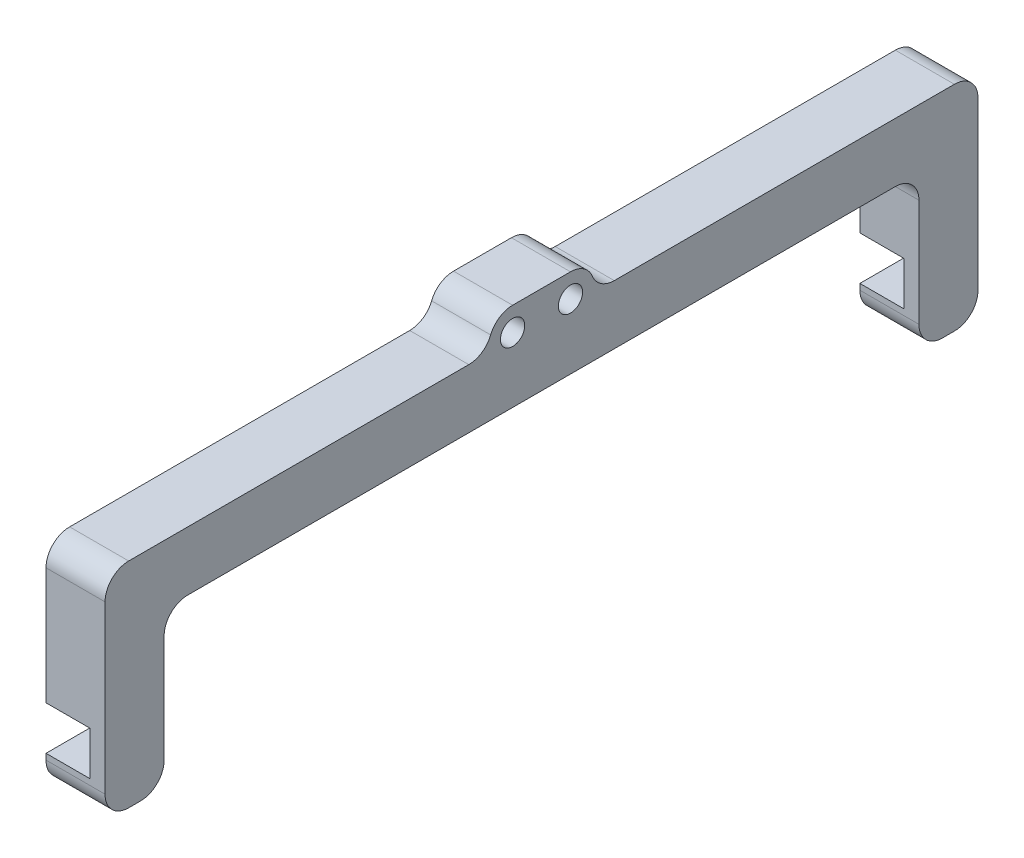
ISO-10303-21;
HEADER;
FILE_DESCRIPTION(('STEP AP214'),'2;1');
FILE_NAME('part.step','',(''),(''),'','','');
FILE_SCHEMA(('AUTOMOTIVE_DESIGN { 1 0 10303 214 1 1 1 1 }'));
ENDSEC;
DATA;
#1=APPLICATION_CONTEXT('core data for automotive mechanical design processes');
#2=APPLICATION_PROTOCOL_DEFINITION('international standard','automotive_design',2000,#1);
#3=PRODUCT_CONTEXT('',#1,'mechanical');
#4=PRODUCT('Part','Part','',(#3));
#5=PRODUCT_RELATED_PRODUCT_CATEGORY('part','',(#4));
#6=PRODUCT_DEFINITION_FORMATION('','',#4);
#7=PRODUCT_DEFINITION_CONTEXT('part definition',#1,'design');
#8=PRODUCT_DEFINITION('design','',#6,#7);
#9=PRODUCT_DEFINITION_SHAPE('','',#8);
#10=(LENGTH_UNIT() NAMED_UNIT(*) SI_UNIT(.MILLI.,.METRE.));
#11=(NAMED_UNIT(*) PLANE_ANGLE_UNIT() SI_UNIT($,.RADIAN.));
#12=(NAMED_UNIT(*) SI_UNIT($,.STERADIAN.) SOLID_ANGLE_UNIT());
#13=UNCERTAINTY_MEASURE_WITH_UNIT(LENGTH_MEASURE(1.E-05),#10,'distance_accuracy_value','');
#14=(GEOMETRIC_REPRESENTATION_CONTEXT(3) GLOBAL_UNCERTAINTY_ASSIGNED_CONTEXT((#13)) GLOBAL_UNIT_ASSIGNED_CONTEXT((#10,
#11,#12)) REPRESENTATION_CONTEXT('',''));
#15=CARTESIAN_POINT('',(0.,0.,0.));
#16=DIRECTION('',(0.,0.,1.));
#17=DIRECTION('',(1.,0.,0.));
#18=AXIS2_PLACEMENT_3D('',#15,#16,#17);
#19=CARTESIAN_POINT('',(-17.0423003142182,-28.8,-72.8));
#20=DIRECTION('',(0.,-1.,0.));
#21=DIRECTION('',(0.,0.,-1.));
#22=AXIS2_PLACEMENT_3D('',#19,#20,#21);
#23=PLANE('',#22);
#24=DIRECTION('',(1.,0.,0.));
#25=VECTOR('',#24,1.);
#26=CARTESIAN_POINT('',(-17.0423003142182,-28.8,-82.8));
#27=LINE('',#26,#25);
#28=CARTESIAN_POINT('',(0.,-28.8,-82.8));
#29=VERTEX_POINT('',#28);
#30=CARTESIAN_POINT('',(7.47106781,-28.8,-82.8));
#31=VERTEX_POINT('',#30);
#32=EDGE_CURVE('E336',#29,#31,#27,.T.);
#33=ORIENTED_EDGE('',*,*,#32,.T.);
#34=DIRECTION('',(0.,0.,-1.));
#35=VECTOR('',#34,1.);
#36=CARTESIAN_POINT('',(7.47106781,-28.8,-82.8));
#37=LINE('',#36,#35);
#38=CARTESIAN_POINT('',(7.47106781,-28.8,-72.8));
#39=VERTEX_POINT('',#38);
#40=EDGE_CURVE('E278',#39,#31,#37,.T.);
#41=ORIENTED_EDGE('',*,*,#40,.F.);
#42=DIRECTION('',(1.,0.,0.));
#43=VECTOR('',#42,1.);
#44=CARTESIAN_POINT('',(-17.0423003142182,-28.8,-72.8));
#45=LINE('',#44,#43);
#46=CARTESIAN_POINT('',(0.,-28.8,-72.8));
#47=VERTEX_POINT('',#46);
#48=EDGE_CURVE('E340',#47,#39,#45,.T.);
#49=ORIENTED_EDGE('',*,*,#48,.F.);
#50=DIRECTION('',(0.,0.,-1.));
#51=VECTOR('',#50,1.);
#52=CARTESIAN_POINT('',(0.,-28.8,-72.8));
#53=LINE('',#52,#51);
#54=EDGE_CURVE('E332',#47,#29,#53,.T.);
#55=ORIENTED_EDGE('',*,*,#54,.T.);
#56=EDGE_LOOP('',(#33,#41,#49,#55));
#57=FACE_BOUND('',#56,.T.);
#58=ADVANCED_FACE('F39',(#57),#23,.T.);
#59=CARTESIAN_POINT('',(-17.0423003142182,-28.8,65.));
#60=DIRECTION('',(0.,-1.,0.));
#61=DIRECTION('',(0.,0.,-1.));
#62=AXIS2_PLACEMENT_3D('',#59,#60,#61);
#63=PLANE('',#62);
#64=DIRECTION('',(1.,0.,0.));
#65=VECTOR('',#64,1.);
#66=CARTESIAN_POINT('',(-17.0423003142182,-28.8,55.));
#67=LINE('',#66,#65);
#68=CARTESIAN_POINT('',(0.,-28.8,55.));
#69=VERTEX_POINT('',#68);
#70=CARTESIAN_POINT('',(7.47106781,-28.8,55.));
#71=VERTEX_POINT('',#70);
#72=EDGE_CURVE('E354',#69,#71,#67,.T.);
#73=ORIENTED_EDGE('',*,*,#72,.T.);
#74=DIRECTION('',(0.,0.,1.));
#75=VECTOR('',#74,1.);
#76=CARTESIAN_POINT('',(7.47106781,-28.8,65.));
#77=LINE('',#76,#75);
#78=CARTESIAN_POINT('',(7.47106781,-28.8,65.));
#79=VERTEX_POINT('',#78);
#80=EDGE_CURVE('E325',#71,#79,#77,.T.);
#81=ORIENTED_EDGE('',*,*,#80,.T.);
#82=DIRECTION('',(1.,0.,0.));
#83=VECTOR('',#82,1.);
#84=CARTESIAN_POINT('',(-17.0423003142182,-28.8,65.));
#85=LINE('',#84,#83);
#86=CARTESIAN_POINT('',(0.,-28.8,65.));
#87=VERTEX_POINT('',#86);
#88=EDGE_CURVE('E359',#87,#79,#85,.T.);
#89=ORIENTED_EDGE('',*,*,#88,.F.);
#90=DIRECTION('',(0.,0.,-1.));
#91=VECTOR('',#90,1.);
#92=CARTESIAN_POINT('',(0.,-28.8,65.));
#93=LINE('',#92,#91);
#94=EDGE_CURVE('E350',#87,#69,#93,.T.);
#95=ORIENTED_EDGE('',*,*,#94,.T.);
#96=EDGE_LOOP('',(#73,#81,#89,#95));
#97=FACE_BOUND('',#96,.T.);
#98=ADVANCED_FACE('F636',(#97),#63,.T.);
#99=CARTESIAN_POINT('',(10.,-15.,65.));
#100=DIRECTION('',(0.,1.,0.));
#101=DIRECTION('',(0.,0.,1.));
#102=AXIS2_PLACEMENT_3D('',#99,#100,#101);
#103=PLANE('',#102);
#104=DIRECTION('',(0.,0.,-1.));
#105=VECTOR('',#104,1.);
#106=CARTESIAN_POINT('',(0.,-15.,65.));
#107=LINE('',#106,#105);
#108=CARTESIAN_POINT('',(0.,-15.,51.));
#109=VERTEX_POINT('',#108);
#110=CARTESIAN_POINT('',(0.,-15.,-68.8));
#111=VERTEX_POINT('',#110);
#112=EDGE_CURVE('E412',#109,#111,#107,.T.);
#113=ORIENTED_EDGE('',*,*,#112,.T.);
#114=DIRECTION('',(1.,0.,0.));
#115=VECTOR('',#114,1.);
#116=CARTESIAN_POINT('',(10.,-15.,-68.8));
#117=LINE('',#116,#115);
#118=CARTESIAN_POINT('',(10.,-15.,-68.8));
#119=VERTEX_POINT('',#118);
#120=EDGE_CURVE('E491',#111,#119,#117,.T.);
#121=ORIENTED_EDGE('',*,*,#120,.T.);
#122=DIRECTION('',(0.,0.,-1.));
#123=VECTOR('',#122,1.);
#124=CARTESIAN_POINT('',(10.,-15.,65.));
#125=LINE('',#124,#123);
#126=CARTESIAN_POINT('',(10.,-15.,51.));
#127=VERTEX_POINT('',#126);
#128=EDGE_CURVE('E390',#127,#119,#125,.T.);
#129=ORIENTED_EDGE('',*,*,#128,.F.);
#130=DIRECTION('',(1.,0.,0.));
#131=VECTOR('',#130,1.);
#132=CARTESIAN_POINT('',(10.,-15.,51.));
#133=LINE('',#132,#131);
#134=EDGE_CURVE('E488',#127,#109,#133,.F.);
#135=ORIENTED_EDGE('',*,*,#134,.T.);
#136=EDGE_LOOP('',(#113,#121,#129,#135));
#137=FACE_BOUND('',#136,.T.);
#138=ADVANCED_FACE('F591',(#137),#103,.F.);
#139=CARTESIAN_POINT('',(10.,-5.,0.));
#140=DIRECTION('',(0.,-1.,0.));
#141=DIRECTION('',(0.,0.,-1.));
#142=AXIS2_PLACEMENT_3D('',#139,#140,#141);
#143=PLANE('',#142);
#144=DIRECTION('',(0.,0.,1.));
#145=VECTOR('',#144,1.);
#146=CARTESIAN_POINT('',(10.,-5.,0.));
#147=LINE('',#146,#145);
#148=CARTESIAN_POINT('',(10.,-5.,3.41619848709566));
#149=VERTEX_POINT('',#148);
#150=CARTESIAN_POINT('',(10.,-5.00000000000001,61.));
#151=VERTEX_POINT('',#150);
#152=EDGE_CURVE('E382',#149,#151,#147,.T.);
#153=ORIENTED_EDGE('',*,*,#152,.F.);
#154=DIRECTION('',(-1.,0.,0.));
#155=VECTOR('',#154,1.);
#156=CARTESIAN_POINT('',(10.,-5.,3.41619848709566));
#157=LINE('',#156,#155);
#158=CARTESIAN_POINT('',(0.,-5.,3.41619848709566));
#159=VERTEX_POINT('',#158);
#160=EDGE_CURVE('E557',#149,#159,#157,.T.);
#161=ORIENTED_EDGE('',*,*,#160,.T.);
#162=DIRECTION('',(0.,0.,1.));
#163=VECTOR('',#162,1.);
#164=CARTESIAN_POINT('',(0.,-5.,0.));
#165=LINE('',#164,#163);
#166=CARTESIAN_POINT('',(0.,-5.00000000000001,61.));
#167=VERTEX_POINT('',#166);
#168=EDGE_CURVE('E370',#159,#167,#165,.T.);
#169=ORIENTED_EDGE('',*,*,#168,.T.);
#170=DIRECTION('',(-1.,0.,0.));
#171=VECTOR('',#170,1.);
#172=CARTESIAN_POINT('',(10.,-5.00000000000001,61.));
#173=LINE('',#172,#171);
#174=EDGE_CURVE('E534',#167,#151,#173,.F.);
#175=ORIENTED_EDGE('',*,*,#174,.T.);
#176=EDGE_LOOP('',(#153,#161,#169,#175));
#177=FACE_BOUND('',#176,.T.);
#178=ADVANCED_FACE('F695',(#177),#143,.F.);
#179=CARTESIAN_POINT('',(10.,-5.00000000000001,65.));
#180=DIRECTION('',(0.,0.,-1.));
#181=DIRECTION('',(-1.,0.,0.));
#182=AXIS2_PLACEMENT_3D('',#179,#180,#181);
#183=PLANE('',#182);
#184=DIRECTION('',(0.,-1.,0.));
#185=VECTOR('',#184,1.);
#186=CARTESIAN_POINT('',(0.,-36.2,65.));
#187=LINE('',#186,#185);
#188=CARTESIAN_POINT('',(0.,-36.2,65.));
#189=VERTEX_POINT('',#188);
#190=CARTESIAN_POINT('',(0.,-37.2,65.));
#191=VERTEX_POINT('',#190);
#192=EDGE_CURVE('E295',#189,#191,#187,.T.);
#193=ORIENTED_EDGE('',*,*,#192,.T.);
#194=DIRECTION('',(1.,0.,0.));
#195=VECTOR('',#194,1.);
#196=CARTESIAN_POINT('',(10.,-37.2,65.));
#197=LINE('',#196,#195);
#198=CARTESIAN_POINT('',(10.,-37.2,65.));
#199=VERTEX_POINT('',#198);
#200=EDGE_CURVE('E519',#191,#199,#197,.T.);
#201=ORIENTED_EDGE('',*,*,#200,.T.);
#202=DIRECTION('',(0.,-1.,0.));
#203=VECTOR('',#202,1.);
#204=CARTESIAN_POINT('',(10.,-5.00000000000001,65.));
#205=LINE('',#204,#203);
#206=CARTESIAN_POINT('',(10.,-9.00000000000001,65.));
#207=VERTEX_POINT('',#206);
#208=EDGE_CURVE('E385',#207,#199,#205,.T.);
#209=ORIENTED_EDGE('',*,*,#208,.F.);
#210=DIRECTION('',(-1.,0.,0.));
#211=VECTOR('',#210,1.);
#212=CARTESIAN_POINT('',(10.,-9.00000000000001,65.));
#213=LINE('',#212,#211);
#214=CARTESIAN_POINT('',(0.,-9.00000000000001,65.));
#215=VERTEX_POINT('',#214);
#216=EDGE_CURVE('E515',#207,#215,#213,.T.);
#217=ORIENTED_EDGE('',*,*,#216,.T.);
#218=DIRECTION('',(0.,-1.,0.));
#219=VECTOR('',#218,1.);
#220=CARTESIAN_POINT('',(0.,-5.00000000000001,65.));
#221=LINE('',#220,#219);
#222=EDGE_CURVE('E409',#215,#87,#221,.T.);
#223=ORIENTED_EDGE('',*,*,#222,.T.);
#224=ORIENTED_EDGE('',*,*,#88,.T.);
#225=DIRECTION('',(0.,-1.,0.));
#226=VECTOR('',#225,1.);
#227=CARTESIAN_POINT('',(7.47106781,-28.8,65.));
#228=LINE('',#227,#226);
#229=CARTESIAN_POINT('',(7.47106781,-36.2,65.));
#230=VERTEX_POINT('',#229);
#231=EDGE_CURVE('E299',#79,#230,#228,.T.);
#232=ORIENTED_EDGE('',*,*,#231,.T.);
#233=DIRECTION('',(1.,0.,0.));
#234=VECTOR('',#233,1.);
#235=CARTESIAN_POINT('',(-11.180339887499,-36.2,65.));
#236=LINE('',#235,#234);
#237=EDGE_CURVE('E300',#189,#230,#236,.T.);
#238=ORIENTED_EDGE('',*,*,#237,.F.);
#239=EDGE_LOOP('',(#193,#201,#209,#217,#223,#224,#232,#238));
#240=FACE_BOUND('',#239,.T.);
#241=ADVANCED_FACE('F624',(#240),#183,.F.);
#242=CARTESIAN_POINT('',(10.,-15.,-82.8));
#243=DIRECTION('',(0.,0.,1.));
#244=DIRECTION('',(1.,0.,0.));
#245=AXIS2_PLACEMENT_3D('',#242,#243,#244);
#246=PLANE('',#245);
#247=DIRECTION('',(0.,1.,0.));
#248=VECTOR('',#247,1.);
#249=CARTESIAN_POINT('',(10.,-15.,-82.8));
#250=LINE('',#249,#248);
#251=CARTESIAN_POINT('',(10.,-37.2,-82.8));
#252=VERTEX_POINT('',#251);
#253=CARTESIAN_POINT('',(10.,-9.,-82.8));
#254=VERTEX_POINT('',#253);
#255=EDGE_CURVE('E394',#252,#254,#250,.T.);
#256=ORIENTED_EDGE('',*,*,#255,.F.);
#257=DIRECTION('',(1.,0.,0.));
#258=VECTOR('',#257,1.);
#259=CARTESIAN_POINT('',(10.,-37.2,-82.8));
#260=LINE('',#259,#258);
#261=CARTESIAN_POINT('',(0.,-37.2,-82.8));
#262=VERTEX_POINT('',#261);
#263=EDGE_CURVE('E474',#252,#262,#260,.F.);
#264=ORIENTED_EDGE('',*,*,#263,.T.);
#265=DIRECTION('',(0.,-1.,0.));
#266=VECTOR('',#265,1.);
#267=CARTESIAN_POINT('',(0.,-36.2,-82.8));
#268=LINE('',#267,#266);
#269=CARTESIAN_POINT('',(0.,-36.2,-82.8));
#270=VERTEX_POINT('',#269);
#271=EDGE_CURVE('E267',#270,#262,#268,.T.);
#272=ORIENTED_EDGE('',*,*,#271,.F.);
#273=DIRECTION('',(1.,0.,0.));
#274=VECTOR('',#273,1.);
#275=CARTESIAN_POINT('',(-11.180339887499,-36.2,-82.8));
#276=LINE('',#275,#274);
#277=CARTESIAN_POINT('',(7.47106781,-36.2,-82.8));
#278=VERTEX_POINT('',#277);
#279=EDGE_CURVE('E264',#270,#278,#276,.T.);
#280=ORIENTED_EDGE('',*,*,#279,.T.);
#281=DIRECTION('',(0.,-1.,0.));
#282=VECTOR('',#281,1.);
#283=CARTESIAN_POINT('',(7.47106781,-28.8,-82.8));
#284=LINE('',#283,#282);
#285=EDGE_CURVE('E249',#31,#278,#284,.T.);
#286=ORIENTED_EDGE('',*,*,#285,.F.);
#287=ORIENTED_EDGE('',*,*,#32,.F.);
#288=DIRECTION('',(0.,1.,0.));
#289=VECTOR('',#288,1.);
#290=CARTESIAN_POINT('',(0.,-15.,-82.8));
#291=LINE('',#290,#289);
#292=CARTESIAN_POINT('',(0.,-9.,-82.8));
#293=VERTEX_POINT('',#292);
#294=EDGE_CURVE('E416',#29,#293,#291,.T.);
#295=ORIENTED_EDGE('',*,*,#294,.T.);
#296=DIRECTION('',(-1.,0.,0.));
#297=VECTOR('',#296,1.);
#298=CARTESIAN_POINT('',(10.,-9.,-82.8));
#299=LINE('',#298,#297);
#300=EDGE_CURVE('E471',#293,#254,#299,.F.);
#301=ORIENTED_EDGE('',*,*,#300,.T.);
#302=EDGE_LOOP('',(#256,#264,#272,#280,#286,#287,#295,#301));
#303=FACE_BOUND('',#302,.T.);
#304=ADVANCED_FACE('F688',(#303),#246,.F.);
#305=CARTESIAN_POINT('',(10.,-5.,-17.8));
#306=DIRECTION('',(0.,-1.,0.));
#307=DIRECTION('',(0.,0.,-1.));
#308=AXIS2_PLACEMENT_3D('',#305,#306,#307);
#309=PLANE('',#308);
#310=DIRECTION('',(0.,0.,1.));
#311=VECTOR('',#310,1.);
#312=CARTESIAN_POINT('',(0.,-5.,-17.8));
#313=LINE('',#312,#311);
#314=CARTESIAN_POINT('',(0.,-5.,-78.8));
#315=VERTEX_POINT('',#314);
#316=CARTESIAN_POINT('',(0.,-5.,-21.2161984870957));
#317=VERTEX_POINT('',#316);
#318=EDGE_CURVE('E420',#315,#317,#313,.T.);
#319=ORIENTED_EDGE('',*,*,#318,.T.);
#320=DIRECTION('',(-1.,0.,0.));
#321=VECTOR('',#320,1.);
#322=CARTESIAN_POINT('',(10.,-5.,-21.2161984870957));
#323=LINE('',#322,#321);
#324=CARTESIAN_POINT('',(10.,-5.,-21.2161984870957));
#325=VERTEX_POINT('',#324);
#326=EDGE_CURVE('E554',#317,#325,#323,.F.);
#327=ORIENTED_EDGE('',*,*,#326,.T.);
#328=DIRECTION('',(0.,0.,1.));
#329=VECTOR('',#328,1.);
#330=CARTESIAN_POINT('',(10.,-5.,-17.8));
#331=LINE('',#330,#329);
#332=CARTESIAN_POINT('',(10.,-5.,-78.8));
#333=VERTEX_POINT('',#332);
#334=EDGE_CURVE('E398',#333,#325,#331,.T.);
#335=ORIENTED_EDGE('',*,*,#334,.F.);
#336=DIRECTION('',(-1.,0.,0.));
#337=VECTOR('',#336,1.);
#338=CARTESIAN_POINT('',(10.,-5.,-78.8));
#339=LINE('',#338,#337);
#340=EDGE_CURVE('E523',#333,#315,#339,.T.);
#341=ORIENTED_EDGE('',*,*,#340,.T.);
#342=EDGE_LOOP('',(#319,#327,#335,#341));
#343=FACE_BOUND('',#342,.T.);
#344=ADVANCED_FACE('F684',(#343),#309,.F.);
#345=CARTESIAN_POINT('',(10.,0.,0.));
#346=DIRECTION('',(0.,-1.,0.));
#347=DIRECTION('',(0.,0.,-1.));
#348=AXIS2_PLACEMENT_3D('',#345,#346,#347);
#349=PLANE('',#348);
#350=DIRECTION('',(0.,0.,1.));
#351=VECTOR('',#350,1.);
#352=CARTESIAN_POINT('',(10.,0.,0.));
#353=LINE('',#352,#351);
#354=CARTESIAN_POINT('',(10.,0.,-13.8));
#355=VERTEX_POINT('',#354);
#356=CARTESIAN_POINT('',(10.,0.,-4.));
#357=VERTEX_POINT('',#356);
#358=EDGE_CURVE('E402',#355,#357,#353,.T.);
#359=ORIENTED_EDGE('',*,*,#358,.F.);
#360=DIRECTION('',(-1.,0.,0.));
#361=VECTOR('',#360,1.);
#362=CARTESIAN_POINT('',(10.,0.,-13.8));
#363=LINE('',#362,#361);
#364=CARTESIAN_POINT('',(0.,0.,-13.8));
#365=VERTEX_POINT('',#364);
#366=EDGE_CURVE('E429',#355,#365,#363,.T.);
#367=ORIENTED_EDGE('',*,*,#366,.T.);
#368=DIRECTION('',(0.,0.,1.));
#369=VECTOR('',#368,1.);
#370=CARTESIAN_POINT('',(0.,0.,0.));
#371=LINE('',#370,#369);
#372=CARTESIAN_POINT('',(0.,0.,-4.));
#373=VERTEX_POINT('',#372);
#374=EDGE_CURVE('E386',#365,#373,#371,.T.);
#375=ORIENTED_EDGE('',*,*,#374,.T.);
#376=DIRECTION('',(-1.,0.,0.));
#377=VECTOR('',#376,1.);
#378=CARTESIAN_POINT('',(10.,0.,-4.));
#379=LINE('',#378,#377);
#380=EDGE_CURVE('E406',#373,#357,#379,.F.);
#381=ORIENTED_EDGE('',*,*,#380,.T.);
#382=EDGE_LOOP('',(#359,#367,#375,#381));
#383=FACE_BOUND('',#382,.T.);
#384=ADVANCED_FACE('F677',(#383),#349,.F.);
#385=CARTESIAN_POINT('',(10.,0.,0.));
#386=DIRECTION('',(-1.,0.,0.));
#387=DIRECTION('',(0.,0.,1.));
#388=AXIS2_PLACEMENT_3D('',#385,#386,#387);
#389=PLANE('',#388);
#390=CARTESIAN_POINT('',(10.,-4.,-4.));
#391=DIRECTION('',(1.,0.,0.));
#392=DIRECTION('',(0.,0.,-1.));
#393=AXIS2_PLACEMENT_3D('',#390,#391,#392);
#394=CIRCLE('',#393,2.055);
#395=CARTESIAN_POINT('',(10.,-4.,-6.055));
#396=VERTEX_POINT('',#395);
#397=EDGE_CURVE('E371',#396,#396,#394,.T.);
#398=ORIENTED_EDGE('',*,*,#397,.F.);
#399=EDGE_LOOP('',(#398));
#400=FACE_BOUND('',#399,.T.);
#401=CARTESIAN_POINT('',(10.,-4.,-13.8));
#402=DIRECTION('',(1.,0.,0.));
#403=DIRECTION('',(0.,0.,-1.));
#404=AXIS2_PLACEMENT_3D('',#401,#402,#403);
#405=CIRCLE('',#404,2.055);
#406=CARTESIAN_POINT('',(10.,-4.,-15.855));
#407=VERTEX_POINT('',#406);
#408=EDGE_CURVE('E365',#407,#407,#405,.T.);
#409=ORIENTED_EDGE('',*,*,#408,.F.);
#410=EDGE_LOOP('',(#409));
#411=FACE_BOUND('',#410,.T.);
#412=DIRECTION('',(0.,0.,1.));
#413=VECTOR('',#412,1.);
#414=CARTESIAN_POINT('',(10.,-41.2,-82.8));
#415=LINE('',#414,#413);
#416=CARTESIAN_POINT('',(10.,-41.2,-78.8));
#417=VERTEX_POINT('',#416);
#418=CARTESIAN_POINT('',(10.,-41.2,-76.8));
#419=VERTEX_POINT('',#418);
#420=EDGE_CURVE('E260',#417,#419,#415,.T.);
#421=ORIENTED_EDGE('',*,*,#420,.F.);
#422=CARTESIAN_POINT('',(10.,-37.2,-78.8));
#423=DIRECTION('',(-1.,0.,0.));
#424=DIRECTION('',(0.,0.,1.));
#425=AXIS2_PLACEMENT_3D('',#422,#423,#424);
#426=CIRCLE('',#425,4.);
#427=EDGE_CURVE('E468',#417,#252,#426,.F.);
#428=ORIENTED_EDGE('',*,*,#427,.T.);
#429=ORIENTED_EDGE('',*,*,#255,.T.);
#430=CARTESIAN_POINT('',(10.,-9.,-78.8));
#431=DIRECTION('',(-1.,0.,0.));
#432=DIRECTION('',(0.,0.,1.));
#433=AXIS2_PLACEMENT_3D('',#430,#431,#432);
#434=CIRCLE('',#433,4.);
#435=EDGE_CURVE('E456',#254,#333,#434,.F.);
#436=ORIENTED_EDGE('',*,*,#435,.T.);
#437=ORIENTED_EDGE('',*,*,#334,.T.);
#438=CARTESIAN_POINT('',(10.,-1.,-21.2161984870957));
#439=DIRECTION('',(-1.,0.,0.));
#440=DIRECTION('',(0.,0.,1.));
#441=AXIS2_PLACEMENT_3D('',#438,#439,#440);
#442=CIRCLE('',#441,4.);
#443=CARTESIAN_POINT('',(10.,-2.5,-17.5080992435478));
#444=VERTEX_POINT('',#443);
#445=EDGE_CURVE('E566',#325,#444,#442,.T.);
#446=ORIENTED_EDGE('',*,*,#445,.T.);
#447=CARTESIAN_POINT('',(10.,-4.,-13.8));
#448=DIRECTION('',(-1.,0.,0.));
#449=DIRECTION('',(0.,0.,1.));
#450=AXIS2_PLACEMENT_3D('',#447,#448,#449);
#451=CIRCLE('',#450,4.);
#452=EDGE_CURVE('E443',#444,#355,#451,.F.);
#453=ORIENTED_EDGE('',*,*,#452,.T.);
#454=ORIENTED_EDGE('',*,*,#358,.T.);
#455=CARTESIAN_POINT('',(10.,-4.,-4.));
#456=DIRECTION('',(-1.,0.,0.));
#457=DIRECTION('',(0.,0.,1.));
#458=AXIS2_PLACEMENT_3D('',#455,#456,#457);
#459=CIRCLE('',#458,4.);
#460=CARTESIAN_POINT('',(10.,-2.5,-0.291900756452169));
#461=VERTEX_POINT('',#460);
#462=EDGE_CURVE('E440',#357,#461,#459,.F.);
#463=ORIENTED_EDGE('',*,*,#462,.T.);
#464=CARTESIAN_POINT('',(10.,-1.,3.41619848709566));
#465=DIRECTION('',(-1.,0.,0.));
#466=DIRECTION('',(0.,0.,1.));
#467=AXIS2_PLACEMENT_3D('',#464,#465,#466);
#468=CIRCLE('',#467,4.);
#469=EDGE_CURVE('E11',#461,#149,#468,.T.);
#470=ORIENTED_EDGE('',*,*,#469,.T.);
#471=ORIENTED_EDGE('',*,*,#152,.T.);
#472=CARTESIAN_POINT('',(10.,-9.00000000000001,61.));
#473=DIRECTION('',(-1.,0.,0.));
#474=DIRECTION('',(0.,0.,1.));
#475=AXIS2_PLACEMENT_3D('',#472,#473,#474);
#476=CIRCLE('',#475,4.);
#477=EDGE_CURVE('E453',#151,#207,#476,.F.);
#478=ORIENTED_EDGE('',*,*,#477,.T.);
#479=ORIENTED_EDGE('',*,*,#208,.T.);
#480=CARTESIAN_POINT('',(10.,-37.2,61.));
#481=DIRECTION('',(-1.,0.,0.));
#482=DIRECTION('',(0.,0.,1.));
#483=AXIS2_PLACEMENT_3D('',#480,#481,#482);
#484=CIRCLE('',#483,4.);
#485=CARTESIAN_POINT('',(10.,-41.2,61.));
#486=VERTEX_POINT('',#485);
#487=EDGE_CURVE('E459',#199,#486,#484,.F.);
#488=ORIENTED_EDGE('',*,*,#487,.T.);
#489=DIRECTION('',(0.,0.,-1.));
#490=VECTOR('',#489,1.);
#491=CARTESIAN_POINT('',(10.,-41.2,65.));
#492=LINE('',#491,#490);
#493=CARTESIAN_POINT('',(10.,-41.2,59.));
#494=VERTEX_POINT('',#493);
#495=EDGE_CURVE('E286',#486,#494,#492,.T.);
#496=ORIENTED_EDGE('',*,*,#495,.T.);
#497=CARTESIAN_POINT('',(10.,-37.2,59.));
#498=DIRECTION('',(-1.,0.,0.));
#499=DIRECTION('',(0.,0.,1.));
#500=AXIS2_PLACEMENT_3D('',#497,#498,#499);
#501=CIRCLE('',#500,4.);
#502=CARTESIAN_POINT('',(10.,-37.2,55.));
#503=VERTEX_POINT('',#502);
#504=EDGE_CURVE('E462',#494,#503,#501,.F.);
#505=ORIENTED_EDGE('',*,*,#504,.T.);
#506=DIRECTION('',(0.,1.,0.));
#507=VECTOR('',#506,1.);
#508=CARTESIAN_POINT('',(10.,-15.,55.));
#509=LINE('',#508,#507);
#510=CARTESIAN_POINT('',(10.,-19.,55.));
#511=VERTEX_POINT('',#510);
#512=EDGE_CURVE('E346',#503,#511,#509,.T.);
#513=ORIENTED_EDGE('',*,*,#512,.T.);
#514=CARTESIAN_POINT('',(10.,-19.,51.));
#515=DIRECTION('',(-1.,0.,0.));
#516=DIRECTION('',(0.,0.,1.));
#517=AXIS2_PLACEMENT_3D('',#514,#515,#516);
#518=CIRCLE('',#517,4.);
#519=EDGE_CURVE('E544',#511,#127,#518,.T.);
#520=ORIENTED_EDGE('',*,*,#519,.T.);
#521=ORIENTED_EDGE('',*,*,#128,.T.);
#522=CARTESIAN_POINT('',(10.,-19.,-68.8));
#523=DIRECTION('',(-1.,0.,0.));
#524=DIRECTION('',(0.,0.,1.));
#525=AXIS2_PLACEMENT_3D('',#522,#523,#524);
#526=CIRCLE('',#525,4.);
#527=CARTESIAN_POINT('',(10.,-19.,-72.8));
#528=VERTEX_POINT('',#527);
#529=EDGE_CURVE('E538',#119,#528,#526,.T.);
#530=ORIENTED_EDGE('',*,*,#529,.T.);
#531=DIRECTION('',(0.,-1.,0.));
#532=VECTOR('',#531,1.);
#533=CARTESIAN_POINT('',(10.,-15.,-72.8));
#534=LINE('',#533,#532);
#535=CARTESIAN_POINT('',(10.,-37.2,-72.8));
#536=VERTEX_POINT('',#535);
#537=EDGE_CURVE('E328',#528,#536,#534,.T.);
#538=ORIENTED_EDGE('',*,*,#537,.T.);
#539=CARTESIAN_POINT('',(10.,-37.2,-76.8));
#540=DIRECTION('',(-1.,0.,0.));
#541=DIRECTION('',(0.,0.,1.));
#542=AXIS2_PLACEMENT_3D('',#539,#540,#541);
#543=CIRCLE('',#542,4.);
#544=EDGE_CURVE('E465',#536,#419,#543,.F.);
#545=ORIENTED_EDGE('',*,*,#544,.T.);
#546=EDGE_LOOP('',(#421,#428,#429,#436,#437,#446,#453,#454,#463,#470,#471,#478,#479,#488,#496,
#505,#513,#520,#521,#530,#538,#545));
#547=FACE_BOUND('',#546,.T.);
#548=ADVANCED_FACE('F584',(#400,#411,#547),#389,.F.);
#549=CARTESIAN_POINT('',(0.,0.,0.));
#550=DIRECTION('',(-1.,0.,0.));
#551=DIRECTION('',(0.,0.,1.));
#552=AXIS2_PLACEMENT_3D('',#549,#550,#551);
#553=PLANE('',#552);
#554=CARTESIAN_POINT('',(0.,-4.,-4.));
#555=DIRECTION('',(1.,0.,0.));
#556=DIRECTION('',(0.,0.,-1.));
#557=AXIS2_PLACEMENT_3D('',#554,#555,#556);
#558=CIRCLE('',#557,2.055);
#559=CARTESIAN_POINT('',(0.,-4.,-6.055));
#560=VERTEX_POINT('',#559);
#561=EDGE_CURVE('E366',#560,#560,#558,.T.);
#562=ORIENTED_EDGE('',*,*,#561,.T.);
#563=EDGE_LOOP('',(#562));
#564=FACE_BOUND('',#563,.T.);
#565=CARTESIAN_POINT('',(0.,-4.,-13.8));
#566=DIRECTION('',(1.,0.,0.));
#567=DIRECTION('',(0.,0.,-1.));
#568=AXIS2_PLACEMENT_3D('',#565,#566,#567);
#569=CIRCLE('',#568,2.055);
#570=CARTESIAN_POINT('',(0.,-4.,-15.855));
#571=VERTEX_POINT('',#570);
#572=EDGE_CURVE('E375',#571,#571,#569,.T.);
#573=ORIENTED_EDGE('',*,*,#572,.T.);
#574=EDGE_LOOP('',(#573));
#575=FACE_BOUND('',#574,.T.);
#576=ORIENTED_EDGE('',*,*,#318,.F.);
#577=CARTESIAN_POINT('',(0.,-9.,-78.8));
#578=DIRECTION('',(-1.,0.,0.));
#579=DIRECTION('',(0.,0.,1.));
#580=AXIS2_PLACEMENT_3D('',#577,#578,#579);
#581=CIRCLE('',#580,4.);
#582=EDGE_CURVE('E531',#315,#293,#581,.T.);
#583=ORIENTED_EDGE('',*,*,#582,.T.);
#584=ORIENTED_EDGE('',*,*,#294,.F.);
#585=ORIENTED_EDGE('',*,*,#54,.F.);
#586=DIRECTION('',(0.,-1.,0.));
#587=VECTOR('',#586,1.);
#588=CARTESIAN_POINT('',(0.,-15.,-72.8));
#589=LINE('',#588,#587);
#590=CARTESIAN_POINT('',(0.,-19.,-72.8));
#591=VERTEX_POINT('',#590);
#592=EDGE_CURVE('E337',#591,#47,#589,.T.);
#593=ORIENTED_EDGE('',*,*,#592,.F.);
#594=CARTESIAN_POINT('',(0.,-19.,-68.8));
#595=DIRECTION('',(-1.,0.,0.));
#596=DIRECTION('',(0.,0.,1.));
#597=AXIS2_PLACEMENT_3D('',#594,#595,#596);
#598=CIRCLE('',#597,4.);
#599=EDGE_CURVE('E541',#591,#111,#598,.F.);
#600=ORIENTED_EDGE('',*,*,#599,.T.);
#601=ORIENTED_EDGE('',*,*,#112,.F.);
#602=CARTESIAN_POINT('',(0.,-19.,51.));
#603=DIRECTION('',(-1.,0.,0.));
#604=DIRECTION('',(0.,0.,1.));
#605=AXIS2_PLACEMENT_3D('',#602,#603,#604);
#606=CIRCLE('',#605,4.);
#607=CARTESIAN_POINT('',(0.,-19.,55.));
#608=VERTEX_POINT('',#607);
#609=EDGE_CURVE('E547',#109,#608,#606,.F.);
#610=ORIENTED_EDGE('',*,*,#609,.T.);
#611=DIRECTION('',(0.,1.,0.));
#612=VECTOR('',#611,1.);
#613=CARTESIAN_POINT('',(0.,-15.,55.));
#614=LINE('',#613,#612);
#615=EDGE_CURVE('E355',#69,#608,#614,.T.);
#616=ORIENTED_EDGE('',*,*,#615,.F.);
#617=ORIENTED_EDGE('',*,*,#94,.F.);
#618=ORIENTED_EDGE('',*,*,#222,.F.);
#619=CARTESIAN_POINT('',(0.,-9.00000000000001,61.));
#620=DIRECTION('',(-1.,0.,0.));
#621=DIRECTION('',(0.,0.,1.));
#622=AXIS2_PLACEMENT_3D('',#619,#620,#621);
#623=CIRCLE('',#622,4.);
#624=EDGE_CURVE('E527',#215,#167,#623,.T.);
#625=ORIENTED_EDGE('',*,*,#624,.T.);
#626=ORIENTED_EDGE('',*,*,#168,.F.);
#627=CARTESIAN_POINT('',(0.,-1.,3.41619848709566));
#628=DIRECTION('',(-1.,0.,0.));
#629=DIRECTION('',(0.,0.,1.));
#630=AXIS2_PLACEMENT_3D('',#627,#628,#629);
#631=CIRCLE('',#630,4.);
#632=CARTESIAN_POINT('',(0.,-2.5,-0.291900756452169));
#633=VERTEX_POINT('',#632);
#634=EDGE_CURVE('E48',#159,#633,#631,.F.);
#635=ORIENTED_EDGE('',*,*,#634,.T.);
#636=CARTESIAN_POINT('',(0.,-4.,-4.));
#637=DIRECTION('',(-1.,0.,0.));
#638=DIRECTION('',(0.,0.,1.));
#639=AXIS2_PLACEMENT_3D('',#636,#637,#638);
#640=CIRCLE('',#639,4.);
#641=EDGE_CURVE('E433',#633,#373,#640,.T.);
#642=ORIENTED_EDGE('',*,*,#641,.T.);
#643=ORIENTED_EDGE('',*,*,#374,.F.);
#644=CARTESIAN_POINT('',(0.,-4.,-13.8));
#645=DIRECTION('',(-1.,0.,0.));
#646=DIRECTION('',(0.,0.,1.));
#647=AXIS2_PLACEMENT_3D('',#644,#645,#646);
#648=CIRCLE('',#647,4.);
#649=CARTESIAN_POINT('',(0.,-2.5,-17.5080992435478));
#650=VERTEX_POINT('',#649);
#651=EDGE_CURVE('E436',#365,#650,#648,.T.);
#652=ORIENTED_EDGE('',*,*,#651,.T.);
#653=CARTESIAN_POINT('',(0.,-1.,-21.2161984870957));
#654=DIRECTION('',(-1.,0.,0.));
#655=DIRECTION('',(0.,0.,1.));
#656=AXIS2_PLACEMENT_3D('',#653,#654,#655);
#657=CIRCLE('',#656,4.);
#658=EDGE_CURVE('E563',#650,#317,#657,.F.);
#659=ORIENTED_EDGE('',*,*,#658,.T.);
#660=EDGE_LOOP('',(#576,#583,#584,#585,#593,#600,#601,#610,#616,#617,#618,#625,#626,#635,#642,
#643,#652,#659));
#661=FACE_BOUND('',#660,.T.);
#662=ADVANCED_FACE('F596',(#564,#575,#661),#553,.T.);
#663=CARTESIAN_POINT('',(0.,-4.,-13.8));
#664=DIRECTION('',(1.,0.,0.));
#665=DIRECTION('',(0.,0.,-1.));
#666=AXIS2_PLACEMENT_3D('',#663,#664,#665);
#667=CYLINDRICAL_SURFACE('',#666,2.055);
#668=ORIENTED_EDGE('',*,*,#572,.F.);
#669=EDGE_LOOP('',(#668));
#670=FACE_BOUND('',#669,.T.);
#671=ORIENTED_EDGE('',*,*,#408,.T.);
#672=EDGE_LOOP('',(#671));
#673=FACE_BOUND('',#672,.T.);
#674=ADVANCED_FACE('F670',(#670,#673),#667,.F.);
#675=CARTESIAN_POINT('',(0.,-4.,-4.));
#676=DIRECTION('',(1.,0.,0.));
#677=DIRECTION('',(0.,0.,-1.));
#678=AXIS2_PLACEMENT_3D('',#675,#676,#677);
#679=CYLINDRICAL_SURFACE('',#678,2.055);
#680=ORIENTED_EDGE('',*,*,#561,.F.);
#681=EDGE_LOOP('',(#680));
#682=FACE_BOUND('',#681,.T.);
#683=ORIENTED_EDGE('',*,*,#397,.T.);
#684=EDGE_LOOP('',(#683));
#685=FACE_BOUND('',#684,.T.);
#686=ADVANCED_FACE('F666',(#682,#685),#679,.F.);
#687=CARTESIAN_POINT('',(-17.0423003142182,-15.,55.));
#688=DIRECTION('',(0.,0.,-1.));
#689=DIRECTION('',(-1.,0.,0.));
#690=AXIS2_PLACEMENT_3D('',#687,#688,#689);
#691=PLANE('',#690);
#692=ORIENTED_EDGE('',*,*,#615,.T.);
#693=DIRECTION('',(1.,0.,0.));
#694=VECTOR('',#693,1.);
#695=CARTESIAN_POINT('',(-17.0423003142182,-19.,55.));
#696=LINE('',#695,#694);
#697=EDGE_CURVE('E498',#608,#511,#696,.T.);
#698=ORIENTED_EDGE('',*,*,#697,.T.);
#699=ORIENTED_EDGE('',*,*,#512,.F.);
#700=DIRECTION('',(1.,0.,0.));
#701=VECTOR('',#700,1.);
#702=CARTESIAN_POINT('',(-17.0423003142182,-37.2,55.));
#703=LINE('',#702,#701);
#704=CARTESIAN_POINT('',(0.,-37.2,55.));
#705=VERTEX_POINT('',#704);
#706=EDGE_CURVE('E495',#503,#705,#703,.F.);
#707=ORIENTED_EDGE('',*,*,#706,.T.);
#708=DIRECTION('',(0.,1.,0.));
#709=VECTOR('',#708,1.);
#710=CARTESIAN_POINT('',(0.,-36.2,55.));
#711=LINE('',#710,#709);
#712=CARTESIAN_POINT('',(0.,-36.2,55.));
#713=VERTEX_POINT('',#712);
#714=EDGE_CURVE('E294',#705,#713,#711,.T.);
#715=ORIENTED_EDGE('',*,*,#714,.T.);
#716=DIRECTION('',(1.,0.,0.));
#717=VECTOR('',#716,1.);
#718=CARTESIAN_POINT('',(-11.180339887499,-36.2,55.));
#719=LINE('',#718,#717);
#720=CARTESIAN_POINT('',(7.47106781,-36.2,55.));
#721=VERTEX_POINT('',#720);
#722=EDGE_CURVE('E305',#713,#721,#719,.T.);
#723=ORIENTED_EDGE('',*,*,#722,.T.);
#724=DIRECTION('',(0.,1.,0.));
#725=VECTOR('',#724,1.);
#726=CARTESIAN_POINT('',(7.47106781,-28.8,55.));
#727=LINE('',#726,#725);
#728=EDGE_CURVE('E321',#721,#71,#727,.T.);
#729=ORIENTED_EDGE('',*,*,#728,.T.);
#730=ORIENTED_EDGE('',*,*,#72,.F.);
#731=EDGE_LOOP('',(#692,#698,#699,#707,#715,#723,#729,#730));
#732=FACE_BOUND('',#731,.T.);
#733=ADVANCED_FACE('F603',(#732),#691,.T.);
#734=CARTESIAN_POINT('',(-17.0423003142182,-15.,-72.8));
#735=DIRECTION('',(0.,0.,1.));
#736=DIRECTION('',(1.,0.,0.));
#737=AXIS2_PLACEMENT_3D('',#734,#735,#736);
#738=PLANE('',#737);
#739=DIRECTION('',(0.,1.,0.));
#740=VECTOR('',#739,1.);
#741=CARTESIAN_POINT('',(0.,-36.2,-72.8));
#742=LINE('',#741,#740);
#743=CARTESIAN_POINT('',(0.,-37.2,-72.8));
#744=VERTEX_POINT('',#743);
#745=CARTESIAN_POINT('',(0.,-36.2,-72.8));
#746=VERTEX_POINT('',#745);
#747=EDGE_CURVE('E236',#744,#746,#742,.T.);
#748=ORIENTED_EDGE('',*,*,#747,.F.);
#749=DIRECTION('',(1.,0.,0.));
#750=VECTOR('',#749,1.);
#751=CARTESIAN_POINT('',(10.,-37.2,-72.8));
#752=LINE('',#751,#750);
#753=EDGE_CURVE('E485',#744,#536,#752,.T.);
#754=ORIENTED_EDGE('',*,*,#753,.T.);
#755=ORIENTED_EDGE('',*,*,#537,.F.);
#756=DIRECTION('',(1.,0.,0.));
#757=VECTOR('',#756,1.);
#758=CARTESIAN_POINT('',(-17.0423003142182,-19.,-72.8));
#759=LINE('',#758,#757);
#760=EDGE_CURVE('E482',#528,#591,#759,.F.);
#761=ORIENTED_EDGE('',*,*,#760,.T.);
#762=ORIENTED_EDGE('',*,*,#592,.T.);
#763=ORIENTED_EDGE('',*,*,#48,.T.);
#764=DIRECTION('',(0.,1.,0.));
#765=VECTOR('',#764,1.);
#766=CARTESIAN_POINT('',(7.47106781,-28.8,-72.8));
#767=LINE('',#766,#765);
#768=CARTESIAN_POINT('',(7.47106781,-36.2,-72.8));
#769=VERTEX_POINT('',#768);
#770=EDGE_CURVE('E256',#769,#39,#767,.T.);
#771=ORIENTED_EDGE('',*,*,#770,.F.);
#772=DIRECTION('',(1.,0.,0.));
#773=VECTOR('',#772,1.);
#774=CARTESIAN_POINT('',(-11.180339887499,-36.2,-72.8));
#775=LINE('',#774,#773);
#776=EDGE_CURVE('E253',#746,#769,#775,.T.);
#777=ORIENTED_EDGE('',*,*,#776,.F.);
#778=EDGE_LOOP('',(#748,#754,#755,#761,#762,#763,#771,#777));
#779=FACE_BOUND('',#778,.T.);
#780=ADVANCED_FACE('F254',(#779),#738,.T.);
#781=CARTESIAN_POINT('',(7.47106781,0.,0.));
#782=DIRECTION('',(1.,0.,0.));
#783=DIRECTION('',(0.,0.,-1.));
#784=AXIS2_PLACEMENT_3D('',#781,#782,#783);
#785=PLANE('',#784);
#786=ORIENTED_EDGE('',*,*,#231,.F.);
#787=ORIENTED_EDGE('',*,*,#80,.F.);
#788=ORIENTED_EDGE('',*,*,#728,.F.);
#789=DIRECTION('',(0.,0.,-1.));
#790=VECTOR('',#789,1.);
#791=CARTESIAN_POINT('',(7.47106781,-36.2,65.));
#792=LINE('',#791,#790);
#793=EDGE_CURVE('E317',#230,#721,#792,.T.);
#794=ORIENTED_EDGE('',*,*,#793,.F.);
#795=EDGE_LOOP('',(#786,#787,#788,#794));
#796=FACE_BOUND('',#795,.T.);
#797=ADVANCED_FACE('F640',(#796),#785,.F.);
#798=CARTESIAN_POINT('',(0.,0.,0.));
#799=DIRECTION('',(-1.,0.,0.));
#800=DIRECTION('',(0.,0.,1.));
#801=AXIS2_PLACEMENT_3D('',#798,#799,#800);
#802=PLANE('',#801);
#803=ORIENTED_EDGE('',*,*,#714,.F.);
#804=CARTESIAN_POINT('',(0.,-37.2,59.));
#805=DIRECTION('',(-1.,0.,0.));
#806=DIRECTION('',(0.,0.,1.));
#807=AXIS2_PLACEMENT_3D('',#804,#805,#806);
#808=CIRCLE('',#807,4.);
#809=CARTESIAN_POINT('',(0.,-41.2,59.));
#810=VERTEX_POINT('',#809);
#811=EDGE_CURVE('E512',#705,#810,#808,.T.);
#812=ORIENTED_EDGE('',*,*,#811,.T.);
#813=DIRECTION('',(0.,0.,-1.));
#814=VECTOR('',#813,1.);
#815=CARTESIAN_POINT('',(0.,-41.2,65.));
#816=LINE('',#815,#814);
#817=CARTESIAN_POINT('',(0.,-41.2,61.));
#818=VERTEX_POINT('',#817);
#819=EDGE_CURVE('E290',#818,#810,#816,.T.);
#820=ORIENTED_EDGE('',*,*,#819,.F.);
#821=CARTESIAN_POINT('',(0.,-37.2,61.));
#822=DIRECTION('',(-1.,0.,0.));
#823=DIRECTION('',(0.,0.,1.));
#824=AXIS2_PLACEMENT_3D('',#821,#822,#823);
#825=CIRCLE('',#824,4.);
#826=EDGE_CURVE('E509',#818,#191,#825,.T.);
#827=ORIENTED_EDGE('',*,*,#826,.T.);
#828=ORIENTED_EDGE('',*,*,#192,.F.);
#829=DIRECTION('',(0.,0.,1.));
#830=VECTOR('',#829,1.);
#831=CARTESIAN_POINT('',(0.,-36.2,65.));
#832=LINE('',#831,#830);
#833=EDGE_CURVE('E301',#713,#189,#832,.T.);
#834=ORIENTED_EDGE('',*,*,#833,.F.);
#835=EDGE_LOOP('',(#803,#812,#820,#827,#828,#834));
#836=FACE_BOUND('',#835,.T.);
#837=ADVANCED_FACE('F618',(#836),#802,.T.);
#838=CARTESIAN_POINT('',(-11.180339887499,-41.2,65.));
#839=DIRECTION('',(0.,-1.,0.));
#840=DIRECTION('',(0.,0.,-1.));
#841=AXIS2_PLACEMENT_3D('',#838,#839,#840);
#842=PLANE('',#841);
#843=ORIENTED_EDGE('',*,*,#819,.T.);
#844=DIRECTION('',(1.,0.,0.));
#845=VECTOR('',#844,1.);
#846=CARTESIAN_POINT('',(-11.180339887499,-41.2,59.));
#847=LINE('',#846,#845);
#848=EDGE_CURVE('E505',#810,#494,#847,.T.);
#849=ORIENTED_EDGE('',*,*,#848,.T.);
#850=ORIENTED_EDGE('',*,*,#495,.F.);
#851=DIRECTION('',(1.,0.,0.));
#852=VECTOR('',#851,1.);
#853=CARTESIAN_POINT('',(0.,-41.2,61.));
#854=LINE('',#853,#852);
#855=EDGE_CURVE('E502',#486,#818,#854,.F.);
#856=ORIENTED_EDGE('',*,*,#855,.T.);
#857=EDGE_LOOP('',(#843,#849,#850,#856));
#858=FACE_BOUND('',#857,.T.);
#859=ADVANCED_FACE('F612',(#858),#842,.T.);
#860=CARTESIAN_POINT('',(-11.180339887499,-36.2,65.));
#861=DIRECTION('',(0.,1.,0.));
#862=DIRECTION('',(0.,0.,1.));
#863=AXIS2_PLACEMENT_3D('',#860,#861,#862);
#864=PLANE('',#863);
#865=ORIENTED_EDGE('',*,*,#237,.T.);
#866=ORIENTED_EDGE('',*,*,#793,.T.);
#867=ORIENTED_EDGE('',*,*,#722,.F.);
#868=ORIENTED_EDGE('',*,*,#833,.T.);
#869=EDGE_LOOP('',(#865,#866,#867,#868));
#870=FACE_BOUND('',#869,.T.);
#871=ADVANCED_FACE('F643',(#870),#864,.T.);
#872=CARTESIAN_POINT('',(7.47106781,0.,-17.8));
#873=DIRECTION('',(1.,0.,0.));
#874=DIRECTION('',(0.,0.,1.));
#875=AXIS2_PLACEMENT_3D('',#872,#873,#874);
#876=PLANE('',#875);
#877=ORIENTED_EDGE('',*,*,#285,.T.);
#878=DIRECTION('',(0.,0.,1.));
#879=VECTOR('',#878,1.);
#880=CARTESIAN_POINT('',(7.47106781,-36.2,-82.8));
#881=LINE('',#880,#879);
#882=EDGE_CURVE('E283',#278,#769,#881,.T.);
#883=ORIENTED_EDGE('',*,*,#882,.T.);
#884=ORIENTED_EDGE('',*,*,#770,.T.);
#885=ORIENTED_EDGE('',*,*,#40,.T.);
#886=EDGE_LOOP('',(#877,#883,#884,#885));
#887=FACE_BOUND('',#886,.T.);
#888=ADVANCED_FACE('F646',(#887),#876,.F.);
#889=CARTESIAN_POINT('',(-11.180339887499,-36.2,-82.8));
#890=DIRECTION('',(0.,-1.,0.));
#891=DIRECTION('',(0.,0.,-1.));
#892=AXIS2_PLACEMENT_3D('',#889,#890,#891);
#893=PLANE('',#892);
#894=ORIENTED_EDGE('',*,*,#776,.T.);
#895=ORIENTED_EDGE('',*,*,#882,.F.);
#896=ORIENTED_EDGE('',*,*,#279,.F.);
#897=DIRECTION('',(0.,0.,-1.));
#898=VECTOR('',#897,1.);
#899=CARTESIAN_POINT('',(0.,-36.2,-82.8));
#900=LINE('',#899,#898);
#901=EDGE_CURVE('E241',#746,#270,#900,.T.);
#902=ORIENTED_EDGE('',*,*,#901,.F.);
#903=EDGE_LOOP('',(#894,#895,#896,#902));
#904=FACE_BOUND('',#903,.T.);
#905=ADVANCED_FACE('F262',(#904),#893,.F.);
#906=CARTESIAN_POINT('',(-11.180339887499,-41.2,-82.8));
#907=DIRECTION('',(0.,1.,0.));
#908=DIRECTION('',(0.,0.,1.));
#909=AXIS2_PLACEMENT_3D('',#906,#907,#908);
#910=PLANE('',#909);
#911=DIRECTION('',(0.,0.,1.));
#912=VECTOR('',#911,1.);
#913=CARTESIAN_POINT('',(0.,-41.2,-82.8));
#914=LINE('',#913,#912);
#915=CARTESIAN_POINT('',(0.,-41.2,-78.8));
#916=VERTEX_POINT('',#915);
#917=CARTESIAN_POINT('',(0.,-41.2,-76.8));
#918=VERTEX_POINT('',#917);
#919=EDGE_CURVE('E250',#916,#918,#914,.T.);
#920=ORIENTED_EDGE('',*,*,#919,.F.);
#921=DIRECTION('',(1.,0.,0.));
#922=VECTOR('',#921,1.);
#923=CARTESIAN_POINT('',(-11.180339887499,-41.2,-78.8));
#924=LINE('',#923,#922);
#925=EDGE_CURVE('E449',#916,#417,#924,.T.);
#926=ORIENTED_EDGE('',*,*,#925,.T.);
#927=ORIENTED_EDGE('',*,*,#420,.T.);
#928=DIRECTION('',(1.,0.,0.));
#929=VECTOR('',#928,1.);
#930=CARTESIAN_POINT('',(0.,-41.2,-76.8));
#931=LINE('',#930,#929);
#932=EDGE_CURVE('E446',#419,#918,#931,.F.);
#933=ORIENTED_EDGE('',*,*,#932,.T.);
#934=EDGE_LOOP('',(#920,#926,#927,#933));
#935=FACE_BOUND('',#934,.T.);
#936=ADVANCED_FACE('F577',(#935),#910,.F.);
#937=CARTESIAN_POINT('',(0.,0.,0.));
#938=DIRECTION('',(-1.,0.,0.));
#939=DIRECTION('',(0.,0.,1.));
#940=AXIS2_PLACEMENT_3D('',#937,#938,#939);
#941=PLANE('',#940);
#942=ORIENTED_EDGE('',*,*,#271,.T.);
#943=CARTESIAN_POINT('',(0.,-37.2,-78.8));
#944=DIRECTION('',(-1.,0.,0.));
#945=DIRECTION('',(0.,0.,1.));
#946=AXIS2_PLACEMENT_3D('',#943,#944,#945);
#947=CIRCLE('',#946,4.);
#948=EDGE_CURVE('E479',#262,#916,#947,.T.);
#949=ORIENTED_EDGE('',*,*,#948,.T.);
#950=ORIENTED_EDGE('',*,*,#919,.T.);
#951=CARTESIAN_POINT('',(0.,-37.2,-76.8));
#952=DIRECTION('',(-1.,0.,0.));
#953=DIRECTION('',(0.,0.,1.));
#954=AXIS2_PLACEMENT_3D('',#951,#952,#953);
#955=CIRCLE('',#954,4.);
#956=EDGE_CURVE('E244',#918,#744,#955,.T.);
#957=ORIENTED_EDGE('',*,*,#956,.T.);
#958=ORIENTED_EDGE('',*,*,#747,.T.);
#959=ORIENTED_EDGE('',*,*,#901,.T.);
#960=EDGE_LOOP('',(#942,#949,#950,#957,#958,#959));
#961=FACE_BOUND('',#960,.T.);
#962=ADVANCED_FACE('F239',(#961),#941,.T.);
#963=CARTESIAN_POINT('',(10.,-4.,-13.8));
#964=DIRECTION('',(-1.,0.,0.));
#965=DIRECTION('',(0.,0.,1.));
#966=AXIS2_PLACEMENT_3D('',#963,#964,#965);
#967=CYLINDRICAL_SURFACE('',#966,4.);
#968=ORIENTED_EDGE('',*,*,#452,.F.);
#969=DIRECTION('',(-1.,0.,0.));
#970=VECTOR('',#969,1.);
#971=CARTESIAN_POINT('',(10.,-2.5,-17.5080992435478));
#972=LINE('',#971,#970);
#973=EDGE_CURVE('E550',#444,#650,#972,.T.);
#974=ORIENTED_EDGE('',*,*,#973,.T.);
#975=ORIENTED_EDGE('',*,*,#651,.F.);
#976=ORIENTED_EDGE('',*,*,#366,.F.);
#977=EDGE_LOOP('',(#968,#974,#975,#976));
#978=FACE_BOUND('',#977,.T.);
#979=ADVANCED_FACE('F701',(#978),#967,.T.);
#980=CARTESIAN_POINT('',(10.,-4.,-4.));
#981=DIRECTION('',(-1.,0.,0.));
#982=DIRECTION('',(0.,0.,1.));
#983=AXIS2_PLACEMENT_3D('',#980,#981,#982);
#984=CYLINDRICAL_SURFACE('',#983,4.);
#985=ORIENTED_EDGE('',*,*,#641,.F.);
#986=DIRECTION('',(-1.,0.,0.));
#987=VECTOR('',#986,1.);
#988=CARTESIAN_POINT('',(10.,-2.5,-0.291900756452169));
#989=LINE('',#988,#987);
#990=EDGE_CURVE('E61',#633,#461,#989,.F.);
#991=ORIENTED_EDGE('',*,*,#990,.T.);
#992=ORIENTED_EDGE('',*,*,#462,.F.);
#993=ORIENTED_EDGE('',*,*,#380,.F.);
#994=EDGE_LOOP('',(#985,#991,#992,#993));
#995=FACE_BOUND('',#994,.T.);
#996=ADVANCED_FACE('F704',(#995),#984,.T.);
#997=CARTESIAN_POINT('',(-11.180339887499,-37.2,-78.8));
#998=DIRECTION('',(1.,0.,0.));
#999=DIRECTION('',(0.,0.,-1.));
#1000=AXIS2_PLACEMENT_3D('',#997,#998,#999);
#1001=CYLINDRICAL_SURFACE('',#1000,4.);
#1002=ORIENTED_EDGE('',*,*,#948,.F.);
#1003=ORIENTED_EDGE('',*,*,#263,.F.);
#1004=ORIENTED_EDGE('',*,*,#427,.F.);
#1005=ORIENTED_EDGE('',*,*,#925,.F.);
#1006=EDGE_LOOP('',(#1002,#1003,#1004,#1005));
#1007=FACE_BOUND('',#1006,.T.);
#1008=ADVANCED_FACE('F708',(#1007),#1001,.T.);
#1009=CARTESIAN_POINT('',(-17.0423003142182,-37.2,-76.8));
#1010=DIRECTION('',(-1.,0.,0.));
#1011=DIRECTION('',(0.,0.,1.));
#1012=AXIS2_PLACEMENT_3D('',#1009,#1010,#1011);
#1013=CYLINDRICAL_SURFACE('',#1012,4.);
#1014=ORIENTED_EDGE('',*,*,#956,.F.);
#1015=ORIENTED_EDGE('',*,*,#932,.F.);
#1016=ORIENTED_EDGE('',*,*,#544,.F.);
#1017=ORIENTED_EDGE('',*,*,#753,.F.);
#1018=EDGE_LOOP('',(#1014,#1015,#1016,#1017));
#1019=FACE_BOUND('',#1018,.T.);
#1020=ADVANCED_FACE('F581',(#1019),#1013,.T.);
#1021=CARTESIAN_POINT('',(10.,-19.,-68.8));
#1022=DIRECTION('',(1.,0.,0.));
#1023=DIRECTION('',(0.,0.,-1.));
#1024=AXIS2_PLACEMENT_3D('',#1021,#1022,#1023);
#1025=CYLINDRICAL_SURFACE('',#1024,4.);
#1026=ORIENTED_EDGE('',*,*,#599,.F.);
#1027=ORIENTED_EDGE('',*,*,#760,.F.);
#1028=ORIENTED_EDGE('',*,*,#529,.F.);
#1029=ORIENTED_EDGE('',*,*,#120,.F.);
#1030=EDGE_LOOP('',(#1026,#1027,#1028,#1029));
#1031=FACE_BOUND('',#1030,.T.);
#1032=ADVANCED_FACE('F589',(#1031),#1025,.F.);
#1033=CARTESIAN_POINT('',(-17.0423003142182,-19.,51.));
#1034=DIRECTION('',(1.,0.,0.));
#1035=DIRECTION('',(0.,0.,-1.));
#1036=AXIS2_PLACEMENT_3D('',#1033,#1034,#1035);
#1037=CYLINDRICAL_SURFACE('',#1036,4.);
#1038=ORIENTED_EDGE('',*,*,#609,.F.);
#1039=ORIENTED_EDGE('',*,*,#134,.F.);
#1040=ORIENTED_EDGE('',*,*,#519,.F.);
#1041=ORIENTED_EDGE('',*,*,#697,.F.);
#1042=EDGE_LOOP('',(#1038,#1039,#1040,#1041));
#1043=FACE_BOUND('',#1042,.T.);
#1044=ADVANCED_FACE('F600',(#1043),#1037,.F.);
#1045=CARTESIAN_POINT('',(-11.180339887499,-37.2,59.));
#1046=DIRECTION('',(1.,0.,0.));
#1047=DIRECTION('',(0.,0.,-1.));
#1048=AXIS2_PLACEMENT_3D('',#1045,#1046,#1047);
#1049=CYLINDRICAL_SURFACE('',#1048,4.);
#1050=ORIENTED_EDGE('',*,*,#811,.F.);
#1051=ORIENTED_EDGE('',*,*,#706,.F.);
#1052=ORIENTED_EDGE('',*,*,#504,.F.);
#1053=ORIENTED_EDGE('',*,*,#848,.F.);
#1054=EDGE_LOOP('',(#1050,#1051,#1052,#1053));
#1055=FACE_BOUND('',#1054,.T.);
#1056=ADVANCED_FACE('F610',(#1055),#1049,.T.);
#1057=CARTESIAN_POINT('',(10.,-37.2,61.));
#1058=DIRECTION('',(-1.,0.,0.));
#1059=DIRECTION('',(0.,0.,1.));
#1060=AXIS2_PLACEMENT_3D('',#1057,#1058,#1059);
#1061=CYLINDRICAL_SURFACE('',#1060,4.);
#1062=ORIENTED_EDGE('',*,*,#826,.F.);
#1063=ORIENTED_EDGE('',*,*,#855,.F.);
#1064=ORIENTED_EDGE('',*,*,#487,.F.);
#1065=ORIENTED_EDGE('',*,*,#200,.F.);
#1066=EDGE_LOOP('',(#1062,#1063,#1064,#1065));
#1067=FACE_BOUND('',#1066,.T.);
#1068=ADVANCED_FACE('F621',(#1067),#1061,.T.);
#1069=CARTESIAN_POINT('',(10.,-9.,-78.8));
#1070=DIRECTION('',(-1.,0.,0.));
#1071=DIRECTION('',(0.,0.,1.));
#1072=AXIS2_PLACEMENT_3D('',#1069,#1070,#1071);
#1073=CYLINDRICAL_SURFACE('',#1072,4.);
#1074=ORIENTED_EDGE('',*,*,#435,.F.);
#1075=ORIENTED_EDGE('',*,*,#300,.F.);
#1076=ORIENTED_EDGE('',*,*,#582,.F.);
#1077=ORIENTED_EDGE('',*,*,#340,.F.);
#1078=EDGE_LOOP('',(#1074,#1075,#1076,#1077));
#1079=FACE_BOUND('',#1078,.T.);
#1080=ADVANCED_FACE('F722',(#1079),#1073,.T.);
#1081=CARTESIAN_POINT('',(10.,-9.00000000000001,61.));
#1082=DIRECTION('',(-1.,0.,0.));
#1083=DIRECTION('',(0.,0.,1.));
#1084=AXIS2_PLACEMENT_3D('',#1081,#1082,#1083);
#1085=CYLINDRICAL_SURFACE('',#1084,4.);
#1086=ORIENTED_EDGE('',*,*,#477,.F.);
#1087=ORIENTED_EDGE('',*,*,#174,.F.);
#1088=ORIENTED_EDGE('',*,*,#624,.F.);
#1089=ORIENTED_EDGE('',*,*,#216,.F.);
#1090=EDGE_LOOP('',(#1086,#1087,#1088,#1089));
#1091=FACE_BOUND('',#1090,.T.);
#1092=ADVANCED_FACE('F631',(#1091),#1085,.T.);
#1093=CARTESIAN_POINT('',(10.,-1.,-21.2161984870957));
#1094=DIRECTION('',(-1.,0.,0.));
#1095=DIRECTION('',(0.,0.,1.));
#1096=AXIS2_PLACEMENT_3D('',#1093,#1094,#1095);
#1097=CYLINDRICAL_SURFACE('',#1096,4.);
#1098=ORIENTED_EDGE('',*,*,#445,.F.);
#1099=ORIENTED_EDGE('',*,*,#326,.F.);
#1100=ORIENTED_EDGE('',*,*,#658,.F.);
#1101=ORIENTED_EDGE('',*,*,#973,.F.);
#1102=EDGE_LOOP('',(#1098,#1099,#1100,#1101));
#1103=FACE_BOUND('',#1102,.T.);
#1104=ADVANCED_FACE('F727',(#1103),#1097,.F.);
#1105=CARTESIAN_POINT('',(10.,-1.,3.41619848709566));
#1106=DIRECTION('',(-1.,0.,0.));
#1107=DIRECTION('',(0.,0.,1.));
#1108=AXIS2_PLACEMENT_3D('',#1105,#1106,#1107);
#1109=CYLINDRICAL_SURFACE('',#1108,4.);
#1110=ORIENTED_EDGE('',*,*,#469,.F.);
#1111=ORIENTED_EDGE('',*,*,#990,.F.);
#1112=ORIENTED_EDGE('',*,*,#634,.F.);
#1113=ORIENTED_EDGE('',*,*,#160,.F.);
#1114=EDGE_LOOP('',(#1110,#1111,#1112,#1113));
#1115=FACE_BOUND('',#1114,.T.);
#1116=ADVANCED_FACE('F41',(#1115),#1109,.F.);
#1117=CLOSED_SHELL('',(#58,#98,#138,#178,#241,#304,#344,#384,#548,#662,#674,#686,#733,#780,#797,
#837,#859,#871,#888,#905,#936,#962,#979,#996,#1008,#1020,#1032,#1044,#1056,#1068,#1080,#1092,
#1104,#1116));
#1118=MANIFOLD_SOLID_BREP('B2',#1117);
#1119=ADVANCED_BREP_SHAPE_REPRESENTATION('',(#18,#1118),#14);
#1120=SHAPE_DEFINITION_REPRESENTATION(#9,#1119);
ENDSEC;
END-ISO-10303-21;
